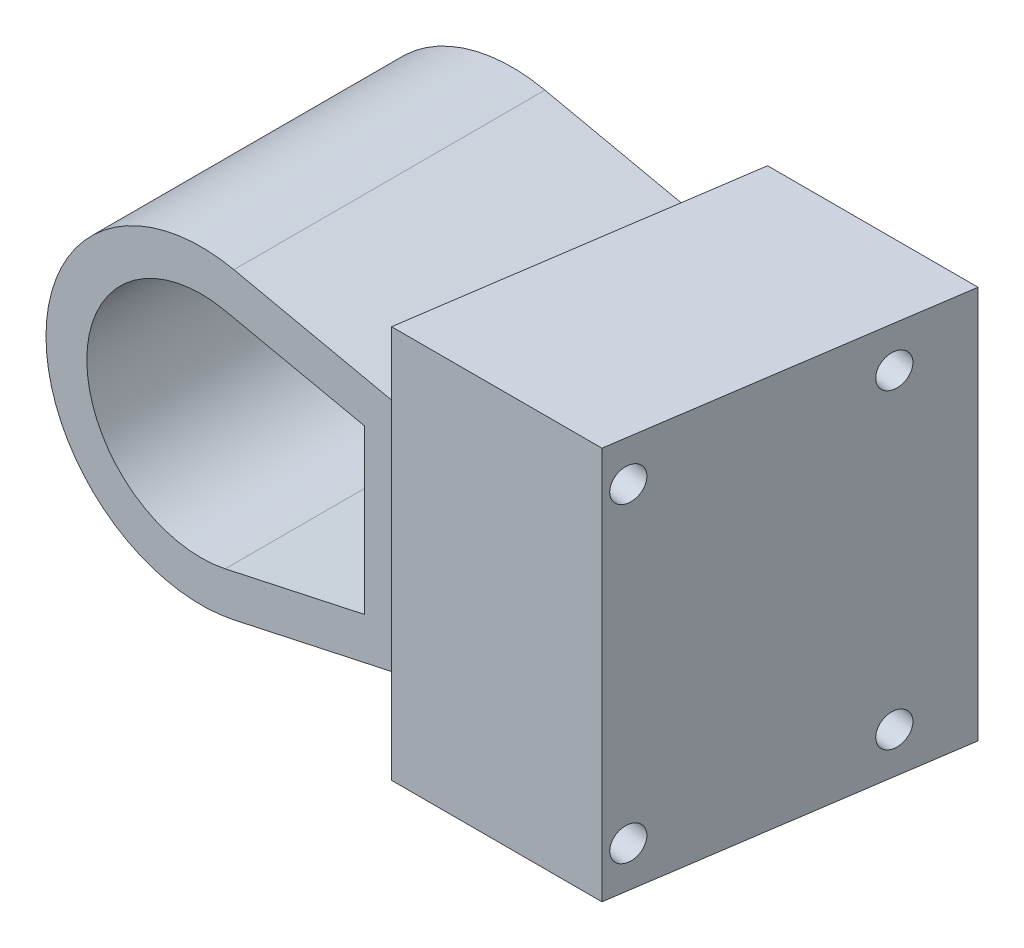
ISO-10303-21;
HEADER;
FILE_DESCRIPTION(('STEP AP214'),'2;1');
FILE_NAME('part.step','',(''),(''),'','','');
FILE_SCHEMA(('AUTOMOTIVE_DESIGN { 1 0 10303 214 1 1 1 1 }'));
ENDSEC;
DATA;
#1=APPLICATION_CONTEXT('core data for automotive mechanical design processes');
#2=APPLICATION_PROTOCOL_DEFINITION('international standard','automotive_design',2000,#1);
#3=PRODUCT_CONTEXT('',#1,'mechanical');
#4=PRODUCT('Part','Part','',(#3));
#5=PRODUCT_RELATED_PRODUCT_CATEGORY('part','',(#4));
#6=PRODUCT_DEFINITION_FORMATION('','',#4);
#7=PRODUCT_DEFINITION_CONTEXT('part definition',#1,'design');
#8=PRODUCT_DEFINITION('design','',#6,#7);
#9=PRODUCT_DEFINITION_SHAPE('','',#8);
#10=(LENGTH_UNIT() NAMED_UNIT(*) SI_UNIT(.MILLI.,.METRE.));
#11=(NAMED_UNIT(*) PLANE_ANGLE_UNIT() SI_UNIT($,.RADIAN.));
#12=(NAMED_UNIT(*) SI_UNIT($,.STERADIAN.) SOLID_ANGLE_UNIT());
#13=UNCERTAINTY_MEASURE_WITH_UNIT(LENGTH_MEASURE(1.E-05),#10,'distance_accuracy_value','');
#14=(GEOMETRIC_REPRESENTATION_CONTEXT(3) GLOBAL_UNCERTAINTY_ASSIGNED_CONTEXT((#13)) GLOBAL_UNIT_ASSIGNED_CONTEXT((#10,
#11,#12)) REPRESENTATION_CONTEXT('',''));
#15=CARTESIAN_POINT('',(0.,0.,0.));
#16=DIRECTION('',(0.,0.,1.));
#17=DIRECTION('',(1.,0.,0.));
#18=AXIS2_PLACEMENT_3D('',#15,#16,#17);
#19=CARTESIAN_POINT('',(-2.30666692097598,-0.12565234013122,38.));
#20=DIRECTION('',(0.,0.,1.));
#21=DIRECTION('',(1.,0.,0.));
#22=AXIS2_PLACEMENT_3D('',#19,#20,#21);
#23=PLANE('',#22);
#24=DIRECTION('',(0.,-1.,0.));
#25=VECTOR('',#24,1.);
#26=CARTESIAN_POINT('',(23.2542228981835,-0.12565234013122,38.));
#27=LINE('',#26,#25);
#28=CARTESIAN_POINT('',(23.2542228981835,14.,38.));
#29=VERTEX_POINT('',#28);
#30=CARTESIAN_POINT('',(23.2542228981835,-14.,38.));
#31=VERTEX_POINT('',#30);
#32=EDGE_CURVE('E63',#29,#31,#27,.T.);
#33=ORIENTED_EDGE('',*,*,#32,.F.);
#34=DIRECTION('',(1.,0.,0.));
#35=VECTOR('',#34,1.);
#36=CARTESIAN_POINT('',(42.6317433366577,14.,38.));
#37=LINE('',#36,#35);
#38=CARTESIAN_POINT('',(22.6317433366577,14.,38.));
#39=VERTEX_POINT('',#38);
#40=EDGE_CURVE('E209',#39,#29,#37,.T.);
#41=ORIENTED_EDGE('',*,*,#40,.F.);
#42=DIRECTION('',(0.,-1.,0.));
#43=VECTOR('',#42,1.);
#44=CARTESIAN_POINT('',(22.6317433366577,14.,38.));
#45=LINE('',#44,#43);
#46=CARTESIAN_POINT('',(22.6317433366577,13.8743476598688,38.));
#47=VERTEX_POINT('',#46);
#48=EDGE_CURVE('E215',#39,#47,#45,.T.);
#49=ORIENTED_EDGE('',*,*,#48,.T.);
#50=DIRECTION('',(-0.977420196479596,0.211304897041662,0.));
#51=VECTOR('',#50,1.);
#52=CARTESIAN_POINT('',(22.6317433366577,13.8743476598688,38.));
#53=LINE('',#52,#51);
#54=CARTESIAN_POINT('',(1.6982985354534,18.3998725204942,38.));
#55=VERTEX_POINT('',#54);
#56=EDGE_CURVE('E265',#47,#55,#53,.T.);
#57=ORIENTED_EDGE('',*,*,#56,.T.);
#58=CARTESIAN_POINT('',(-2.30666692097598,-0.12565234013122,38.));
#59=DIRECTION('',(0.,0.,1.));
#60=DIRECTION('',(1.,0.,0.));
#61=AXIS2_PLACEMENT_3D('',#58,#59,#60);
#62=CIRCLE('',#61,18.9534909625863);
#63=CARTESIAN_POINT('',(1.69829853545341,-18.6511772007566,38.));
#64=VERTEX_POINT('',#63);
#65=EDGE_CURVE('E267',#55,#64,#62,.T.);
#66=ORIENTED_EDGE('',*,*,#65,.T.);
#67=DIRECTION('',(0.977420196479596,0.211304897041662,0.));
#68=VECTOR('',#67,1.);
#69=CARTESIAN_POINT('',(1.69829853545342,-18.6511772007566,38.));
#70=LINE('',#69,#68);
#71=CARTESIAN_POINT('',(22.6317433366577,-14.1256523401312,38.));
#72=VERTEX_POINT('',#71);
#73=EDGE_CURVE('E258',#64,#72,#70,.T.);
#74=ORIENTED_EDGE('',*,*,#73,.T.);
#75=DIRECTION('',(0.,1.,0.));
#76=VECTOR('',#75,1.);
#77=CARTESIAN_POINT('',(22.6317433366577,-14.1256523401312,38.));
#78=LINE('',#77,#76);
#79=CARTESIAN_POINT('',(22.6317433366577,-14.,38.));
#80=VERTEX_POINT('',#79);
#81=EDGE_CURVE('E261',#72,#80,#78,.T.);
#82=ORIENTED_EDGE('',*,*,#81,.T.);
#83=DIRECTION('',(1.,0.,0.));
#84=VECTOR('',#83,1.);
#85=CARTESIAN_POINT('',(42.6317433366577,-14.,38.));
#86=LINE('',#85,#84);
#87=EDGE_CURVE('E208',#80,#31,#86,.T.);
#88=ORIENTED_EDGE('',*,*,#87,.T.);
#89=EDGE_LOOP('',(#33,#41,#49,#57,#66,#74,#82,#88));
#90=FACE_BOUND('',#89,.T.);
#91=DIRECTION('',(0.,1.,0.));
#92=VECTOR('',#91,1.);
#93=CARTESIAN_POINT('',(17.6440612851309,-10.1010164431847,38.));
#94=LINE('',#93,#92);
#95=CARTESIAN_POINT('',(17.6440612851309,-10.1010164431847,38.));
#96=VERTEX_POINT('',#95);
#97=CARTESIAN_POINT('',(17.6440612851309,9.84971176292224,38.));
#98=VERTEX_POINT('',#97);
#99=EDGE_CURVE('E228',#96,#98,#94,.T.);
#100=ORIENTED_EDGE('',*,*,#99,.F.);
#101=DIRECTION('',(0.977420196479597,0.211304897041662,0.));
#102=VECTOR('',#101,1.);
#103=CARTESIAN_POINT('',(0.644376893079009,-13.7761160299756,38.));
#104=LINE('',#103,#102);
#105=CARTESIAN_POINT('',(0.644376893079007,-13.7761160299756,38.));
#106=VERTEX_POINT('',#105);
#107=EDGE_CURVE('E226',#106,#96,#104,.T.);
#108=ORIENTED_EDGE('',*,*,#107,.F.);
#109=CARTESIAN_POINT('',(-2.30666692097598,-0.12565234013122,38.));
#110=DIRECTION('',(0.,0.,1.));
#111=DIRECTION('',(1.,0.,0.));
#112=AXIS2_PLACEMENT_3D('',#109,#110,#111);
#113=CIRCLE('',#112,13.9658089110596);
#114=CARTESIAN_POINT('',(0.644376893079009,13.5248113497132,38.));
#115=VERTEX_POINT('',#114);
#116=EDGE_CURVE('E234',#115,#106,#113,.T.);
#117=ORIENTED_EDGE('',*,*,#116,.F.);
#118=DIRECTION('',(-0.977420196479597,0.211304897041662,0.));
#119=VECTOR('',#118,1.);
#120=CARTESIAN_POINT('',(17.6440612851309,9.84971176292224,38.));
#121=LINE('',#120,#119);
#122=EDGE_CURVE('E231',#98,#115,#121,.T.);
#123=ORIENTED_EDGE('',*,*,#122,.F.);
#124=EDGE_LOOP('',(#100,#108,#117,#123));
#125=FACE_BOUND('',#124,.T.);
#126=ADVANCED_FACE('F38',(#90,#125),#23,.T.);
#127=CARTESIAN_POINT('',(-2.30666692097598,-0.12565234013122,0.));
#128=DIRECTION('',(0.,0.,1.));
#129=DIRECTION('',(1.,0.,0.));
#130=AXIS2_PLACEMENT_3D('',#127,#128,#129);
#131=PLANE('',#130);
#132=DIRECTION('',(-1.,0.,0.));
#133=VECTOR('',#132,1.);
#134=CARTESIAN_POINT('',(22.6317433366577,14.,0.));
#135=LINE('',#134,#133);
#136=CARTESIAN_POINT('',(28.8994634293882,14.,0.));
#137=VERTEX_POINT('',#136);
#138=CARTESIAN_POINT('',(22.6317433366577,14.,0.));
#139=VERTEX_POINT('',#138);
#140=EDGE_CURVE('E162',#137,#139,#135,.T.);
#141=ORIENTED_EDGE('',*,*,#140,.F.);
#142=DIRECTION('',(0.,1.,0.));
#143=VECTOR('',#142,1.);
#144=CARTESIAN_POINT('',(28.8994634293882,-24.,0.));
#145=LINE('',#144,#143);
#146=CARTESIAN_POINT('',(28.8994634293882,24.,0.));
#147=VERTEX_POINT('',#146);
#148=EDGE_CURVE('E155',#137,#147,#145,.T.);
#149=ORIENTED_EDGE('',*,*,#148,.T.);
#150=DIRECTION('',(-1.,0.,0.));
#151=VECTOR('',#150,1.);
#152=CARTESIAN_POINT('',(28.8994634293882,24.,0.));
#153=LINE('',#152,#151);
#154=CARTESIAN_POINT('',(54.608549056261,24.,0.));
#155=VERTEX_POINT('',#154);
#156=EDGE_CURVE('E160',#155,#147,#153,.T.);
#157=ORIENTED_EDGE('',*,*,#156,.F.);
#158=DIRECTION('',(0.,1.,0.));
#159=VECTOR('',#158,1.);
#160=CARTESIAN_POINT('',(54.608549056261,-24.,0.));
#161=LINE('',#160,#159);
#162=CARTESIAN_POINT('',(54.608549056261,-24.,0.));
#163=VERTEX_POINT('',#162);
#164=EDGE_CURVE('E200',#163,#155,#161,.T.);
#165=ORIENTED_EDGE('',*,*,#164,.F.);
#166=DIRECTION('',(-1.,0.,0.));
#167=VECTOR('',#166,1.);
#168=CARTESIAN_POINT('',(28.8994634293882,-24.,0.));
#169=LINE('',#168,#167);
#170=CARTESIAN_POINT('',(28.8994634293882,-24.,0.));
#171=VERTEX_POINT('',#170);
#172=EDGE_CURVE('E190',#163,#171,#169,.T.);
#173=ORIENTED_EDGE('',*,*,#172,.T.);
#174=CARTESIAN_POINT('',(28.8994634293882,-14.,0.));
#175=VERTEX_POINT('',#174);
#176=EDGE_CURVE('E164',#171,#175,#145,.T.);
#177=ORIENTED_EDGE('',*,*,#176,.T.);
#178=DIRECTION('',(-1.,0.,0.));
#179=VECTOR('',#178,1.);
#180=CARTESIAN_POINT('',(22.6317433366577,-14.,0.));
#181=LINE('',#180,#179);
#182=CARTESIAN_POINT('',(22.6317433366577,-14.,0.));
#183=VERTEX_POINT('',#182);
#184=EDGE_CURVE('E217',#175,#183,#181,.T.);
#185=ORIENTED_EDGE('',*,*,#184,.T.);
#186=DIRECTION('',(0.,1.,0.));
#187=VECTOR('',#186,1.);
#188=CARTESIAN_POINT('',(22.6317433366577,-14.1256523401312,0.));
#189=LINE('',#188,#187);
#190=CARTESIAN_POINT('',(22.6317433366577,-14.1256523401312,0.));
#191=VERTEX_POINT('',#190);
#192=EDGE_CURVE('E272',#191,#183,#189,.T.);
#193=ORIENTED_EDGE('',*,*,#192,.F.);
#194=DIRECTION('',(0.977420196479596,0.211304897041662,0.));
#195=VECTOR('',#194,1.);
#196=CARTESIAN_POINT('',(1.69829853545342,-18.6511772007566,0.));
#197=LINE('',#196,#195);
#198=CARTESIAN_POINT('',(1.69829853545341,-18.6511772007566,0.));
#199=VERTEX_POINT('',#198);
#200=EDGE_CURVE('E257',#199,#191,#197,.T.);
#201=ORIENTED_EDGE('',*,*,#200,.F.);
#202=CARTESIAN_POINT('',(-2.30666692097598,-0.12565234013122,0.));
#203=DIRECTION('',(0.,0.,1.));
#204=DIRECTION('',(1.,0.,0.));
#205=AXIS2_PLACEMENT_3D('',#202,#203,#204);
#206=CIRCLE('',#205,18.9534909625864);
#207=CARTESIAN_POINT('',(1.6982985354534,18.3998725204942,0.));
#208=VERTEX_POINT('',#207);
#209=EDGE_CURVE('E262',#208,#199,#206,.T.);
#210=ORIENTED_EDGE('',*,*,#209,.F.);
#211=DIRECTION('',(-0.977420196479596,0.211304897041662,0.));
#212=VECTOR('',#211,1.);
#213=CARTESIAN_POINT('',(22.6317433366577,13.8743476598688,0.));
#214=LINE('',#213,#212);
#215=CARTESIAN_POINT('',(22.6317433366577,13.8743476598688,0.));
#216=VERTEX_POINT('',#215);
#217=EDGE_CURVE('E275',#216,#208,#214,.T.);
#218=ORIENTED_EDGE('',*,*,#217,.F.);
#219=DIRECTION('',(0.,-1.,0.));
#220=VECTOR('',#219,1.);
#221=CARTESIAN_POINT('',(22.6317433366577,14.,0.));
#222=LINE('',#221,#220);
#223=EDGE_CURVE('E223',#139,#216,#222,.T.);
#224=ORIENTED_EDGE('',*,*,#223,.F.);
#225=EDGE_LOOP('',(#141,#149,#157,#165,#173,#177,#185,#193,#201,#210,#218,#224));
#226=FACE_BOUND('',#225,.T.);
#227=DIRECTION('',(0.977420196479597,0.211304897041662,0.));
#228=VECTOR('',#227,1.);
#229=CARTESIAN_POINT('',(0.644376893079009,-13.7761160299756,0.));
#230=LINE('',#229,#228);
#231=CARTESIAN_POINT('',(0.644376893079007,-13.7761160299756,0.));
#232=VERTEX_POINT('',#231);
#233=CARTESIAN_POINT('',(17.6440612851309,-10.1010164431847,0.));
#234=VERTEX_POINT('',#233);
#235=EDGE_CURVE('E225',#232,#234,#230,.T.);
#236=ORIENTED_EDGE('',*,*,#235,.T.);
#237=DIRECTION('',(0.,1.,0.));
#238=VECTOR('',#237,1.);
#239=CARTESIAN_POINT('',(17.6440612851309,-10.1010164431847,0.));
#240=LINE('',#239,#238);
#241=CARTESIAN_POINT('',(17.6440612851309,9.84971176292224,0.));
#242=VERTEX_POINT('',#241);
#243=EDGE_CURVE('E239',#234,#242,#240,.T.);
#244=ORIENTED_EDGE('',*,*,#243,.T.);
#245=DIRECTION('',(-0.977420196479597,0.211304897041662,0.));
#246=VECTOR('',#245,1.);
#247=CARTESIAN_POINT('',(17.6440612851309,9.84971176292224,0.));
#248=LINE('',#247,#246);
#249=CARTESIAN_POINT('',(0.644376893079009,13.5248113497132,0.));
#250=VERTEX_POINT('',#249);
#251=EDGE_CURVE('E242',#242,#250,#248,.T.);
#252=ORIENTED_EDGE('',*,*,#251,.T.);
#253=CARTESIAN_POINT('',(-2.30666692097598,-0.12565234013122,0.));
#254=DIRECTION('',(0.,0.,1.));
#255=DIRECTION('',(1.,0.,0.));
#256=AXIS2_PLACEMENT_3D('',#253,#254,#255);
#257=CIRCLE('',#256,13.9658089110596);
#258=EDGE_CURVE('E229',#250,#232,#257,.T.);
#259=ORIENTED_EDGE('',*,*,#258,.T.);
#260=EDGE_LOOP('',(#236,#244,#252,#259));
#261=FACE_BOUND('',#260,.T.);
#262=ADVANCED_FACE('F157',(#226,#261),#131,.F.);
#263=CARTESIAN_POINT('',(1.69829853545342,-18.6511772007566,38.));
#264=DIRECTION('',(-0.211304897041662,0.977420196479596,0.));
#265=DIRECTION('',(-0.977420196479596,-0.211304897041662,0.));
#266=AXIS2_PLACEMENT_3D('',#263,#264,#265);
#267=PLANE('',#266);
#268=ORIENTED_EDGE('',*,*,#200,.T.);
#269=DIRECTION('',(0.,0.,-1.));
#270=VECTOR('',#269,1.);
#271=CARTESIAN_POINT('',(22.6317433366577,-14.1256523401312,38.));
#272=LINE('',#271,#270);
#273=EDGE_CURVE('E47',#72,#191,#272,.T.);
#274=ORIENTED_EDGE('',*,*,#273,.F.);
#275=ORIENTED_EDGE('',*,*,#73,.F.);
#276=DIRECTION('',(0.,0.,-1.));
#277=VECTOR('',#276,1.);
#278=CARTESIAN_POINT('',(1.69829853545341,-18.6511772007566,38.));
#279=LINE('',#278,#277);
#280=EDGE_CURVE('E269',#64,#199,#279,.T.);
#281=ORIENTED_EDGE('',*,*,#280,.T.);
#282=EDGE_LOOP('',(#268,#274,#275,#281));
#283=FACE_BOUND('',#282,.T.);
#284=ADVANCED_FACE('F40',(#283),#267,.F.);
#285=CARTESIAN_POINT('',(22.6317433366577,-14.1256523401312,38.));
#286=DIRECTION('',(-1.,0.,0.));
#287=DIRECTION('',(0.,0.,1.));
#288=AXIS2_PLACEMENT_3D('',#285,#286,#287);
#289=PLANE('',#288);
#290=ORIENTED_EDGE('',*,*,#192,.T.);
#291=DIRECTION('',(0.,0.,1.));
#292=VECTOR('',#291,1.);
#293=CARTESIAN_POINT('',(22.6317433366577,-14.,38.));
#294=LINE('',#293,#292);
#295=EDGE_CURVE('E211',#183,#80,#294,.T.);
#296=ORIENTED_EDGE('',*,*,#295,.T.);
#297=ORIENTED_EDGE('',*,*,#81,.F.);
#298=ORIENTED_EDGE('',*,*,#273,.T.);
#299=EDGE_LOOP('',(#290,#296,#297,#298));
#300=FACE_BOUND('',#299,.T.);
#301=ADVANCED_FACE('F321',(#300),#289,.F.);
#302=CARTESIAN_POINT('',(22.6317433366577,13.8743476598688,38.));
#303=DIRECTION('',(-0.211304897041662,-0.977420196479596,0.));
#304=DIRECTION('',(0.977420196479596,-0.211304897041662,0.));
#305=AXIS2_PLACEMENT_3D('',#302,#303,#304);
#306=PLANE('',#305);
#307=ORIENTED_EDGE('',*,*,#217,.T.);
#308=DIRECTION('',(0.,0.,-1.));
#309=VECTOR('',#308,1.);
#310=CARTESIAN_POINT('',(1.6982985354534,18.3998725204942,38.));
#311=LINE('',#310,#309);
#312=EDGE_CURVE('E281',#55,#208,#311,.T.);
#313=ORIENTED_EDGE('',*,*,#312,.F.);
#314=ORIENTED_EDGE('',*,*,#56,.F.);
#315=DIRECTION('',(0.,0.,-1.));
#316=VECTOR('',#315,1.);
#317=CARTESIAN_POINT('',(22.6317433366577,13.8743476598688,38.));
#318=LINE('',#317,#316);
#319=EDGE_CURVE('E284',#47,#216,#318,.T.);
#320=ORIENTED_EDGE('',*,*,#319,.T.);
#321=EDGE_LOOP('',(#307,#313,#314,#320));
#322=FACE_BOUND('',#321,.T.);
#323=ADVANCED_FACE('F330',(#322),#306,.F.);
#324=CARTESIAN_POINT('',(-2.30666692097598,-0.12565234013122,38.));
#325=DIRECTION('',(0.,0.,-1.));
#326=DIRECTION('',(-1.,0.,0.));
#327=AXIS2_PLACEMENT_3D('',#324,#325,#326);
#328=CYLINDRICAL_SURFACE('',#327,18.9534909625864);
#329=ORIENTED_EDGE('',*,*,#209,.T.);
#330=ORIENTED_EDGE('',*,*,#280,.F.);
#331=ORIENTED_EDGE('',*,*,#65,.F.);
#332=ORIENTED_EDGE('',*,*,#312,.T.);
#333=EDGE_LOOP('',(#329,#330,#331,#332));
#334=FACE_BOUND('',#333,.T.);
#335=ADVANCED_FACE('F333',(#334),#328,.T.);
#336=CARTESIAN_POINT('',(0.644376893079009,-13.7761160299756,38.));
#337=DIRECTION('',(-0.211304897041662,0.977420196479596,0.));
#338=DIRECTION('',(-0.977420196479597,-0.211304897041662,0.));
#339=AXIS2_PLACEMENT_3D('',#336,#337,#338);
#340=PLANE('',#339);
#341=ORIENTED_EDGE('',*,*,#235,.F.);
#342=DIRECTION('',(0.,0.,-1.));
#343=VECTOR('',#342,1.);
#344=CARTESIAN_POINT('',(0.644376893079007,-13.7761160299756,38.));
#345=LINE('',#344,#343);
#346=EDGE_CURVE('E236',#106,#232,#345,.T.);
#347=ORIENTED_EDGE('',*,*,#346,.F.);
#348=ORIENTED_EDGE('',*,*,#107,.T.);
#349=DIRECTION('',(0.,0.,-1.));
#350=VECTOR('',#349,1.);
#351=CARTESIAN_POINT('',(17.6440612851309,-10.1010164431847,38.));
#352=LINE('',#351,#350);
#353=EDGE_CURVE('E254',#96,#234,#352,.T.);
#354=ORIENTED_EDGE('',*,*,#353,.T.);
#355=EDGE_LOOP('',(#341,#347,#348,#354));
#356=FACE_BOUND('',#355,.T.);
#357=ADVANCED_FACE('F357',(#356),#340,.T.);
#358=CARTESIAN_POINT('',(17.6440612851309,-10.1010164431847,38.));
#359=DIRECTION('',(-1.,0.,0.));
#360=DIRECTION('',(0.,0.,1.));
#361=AXIS2_PLACEMENT_3D('',#358,#359,#360);
#362=PLANE('',#361);
#363=ORIENTED_EDGE('',*,*,#243,.F.);
#364=ORIENTED_EDGE('',*,*,#353,.F.);
#365=ORIENTED_EDGE('',*,*,#99,.T.);
#366=DIRECTION('',(0.,0.,-1.));
#367=VECTOR('',#366,1.);
#368=CARTESIAN_POINT('',(17.6440612851309,9.84971176292224,38.));
#369=LINE('',#368,#367);
#370=EDGE_CURVE('E252',#98,#242,#369,.T.);
#371=ORIENTED_EDGE('',*,*,#370,.T.);
#372=EDGE_LOOP('',(#363,#364,#365,#371));
#373=FACE_BOUND('',#372,.T.);
#374=ADVANCED_FACE('F540',(#373),#362,.T.);
#375=CARTESIAN_POINT('',(17.6440612851309,9.84971176292224,38.));
#376=DIRECTION('',(-0.211304897041662,-0.977420196479596,0.));
#377=DIRECTION('',(0.977420196479597,-0.211304897041662,0.));
#378=AXIS2_PLACEMENT_3D('',#375,#376,#377);
#379=PLANE('',#378);
#380=ORIENTED_EDGE('',*,*,#251,.F.);
#381=ORIENTED_EDGE('',*,*,#370,.F.);
#382=ORIENTED_EDGE('',*,*,#122,.T.);
#383=DIRECTION('',(0.,0.,-1.));
#384=VECTOR('',#383,1.);
#385=CARTESIAN_POINT('',(0.644376893079009,13.5248113497132,38.));
#386=LINE('',#385,#384);
#387=EDGE_CURVE('E249',#115,#250,#386,.T.);
#388=ORIENTED_EDGE('',*,*,#387,.T.);
#389=EDGE_LOOP('',(#380,#381,#382,#388));
#390=FACE_BOUND('',#389,.T.);
#391=ADVANCED_FACE('F510',(#390),#379,.T.);
#392=CARTESIAN_POINT('',(-2.30666692097598,-0.12565234013122,38.));
#393=DIRECTION('',(0.,0.,-1.));
#394=DIRECTION('',(-1.,0.,0.));
#395=AXIS2_PLACEMENT_3D('',#392,#393,#394);
#396=CYLINDRICAL_SURFACE('',#395,13.9658089110596);
#397=ORIENTED_EDGE('',*,*,#258,.F.);
#398=ORIENTED_EDGE('',*,*,#387,.F.);
#399=ORIENTED_EDGE('',*,*,#116,.T.);
#400=ORIENTED_EDGE('',*,*,#346,.T.);
#401=EDGE_LOOP('',(#397,#398,#399,#400));
#402=FACE_BOUND('',#401,.T.);
#403=ADVANCED_FACE('F347',(#402),#396,.F.);
#404=CARTESIAN_POINT('',(22.6317433366577,14.,38.));
#405=DIRECTION('',(1.,0.,0.));
#406=DIRECTION('',(0.,0.,-1.));
#407=AXIS2_PLACEMENT_3D('',#404,#405,#406);
#408=PLANE('',#407);
#409=ORIENTED_EDGE('',*,*,#319,.F.);
#410=ORIENTED_EDGE('',*,*,#48,.F.);
#411=DIRECTION('',(0.,0.,1.));
#412=VECTOR('',#411,1.);
#413=CARTESIAN_POINT('',(22.6317433366577,14.,38.));
#414=LINE('',#413,#412);
#415=EDGE_CURVE('E213',#139,#39,#414,.T.);
#416=ORIENTED_EDGE('',*,*,#415,.F.);
#417=ORIENTED_EDGE('',*,*,#223,.T.);
#418=EDGE_LOOP('',(#409,#410,#416,#417));
#419=FACE_BOUND('',#418,.T.);
#420=ADVANCED_FACE('F338',(#419),#408,.F.);
#421=CARTESIAN_POINT('',(0.,14.,0.));
#422=DIRECTION('',(0.,-1.,0.));
#423=DIRECTION('',(0.,0.,-1.));
#424=AXIS2_PLACEMENT_3D('',#421,#422,#423);
#425=PLANE('',#424);
#426=ORIENTED_EDGE('',*,*,#40,.T.);
#427=DIRECTION('',(0.146946275799005,0.,-0.989144474800725));
#428=VECTOR('',#427,1.);
#429=CARTESIAN_POINT('',(28.2754313053014,14.,4.20056870636791));
#430=LINE('',#429,#428);
#431=EDGE_CURVE('E55',#29,#137,#430,.T.);
#432=ORIENTED_EDGE('',*,*,#431,.T.);
#433=ORIENTED_EDGE('',*,*,#140,.T.);
#434=ORIENTED_EDGE('',*,*,#415,.T.);
#435=EDGE_LOOP('',(#426,#432,#433,#434));
#436=FACE_BOUND('',#435,.T.);
#437=ADVANCED_FACE('F339',(#436),#425,.F.);
#438=CARTESIAN_POINT('',(0.,-14.,0.));
#439=DIRECTION('',(0.,-1.,0.));
#440=DIRECTION('',(0.,0.,-1.));
#441=AXIS2_PLACEMENT_3D('',#438,#439,#440);
#442=PLANE('',#441);
#443=DIRECTION('',(0.146946275799005,0.,-0.989144474800725));
#444=VECTOR('',#443,1.);
#445=CARTESIAN_POINT('',(28.2754313053014,-14.,4.20056870636791));
#446=LINE('',#445,#444);
#447=EDGE_CURVE('E11',#31,#175,#446,.T.);
#448=ORIENTED_EDGE('',*,*,#447,.F.);
#449=ORIENTED_EDGE('',*,*,#87,.F.);
#450=ORIENTED_EDGE('',*,*,#295,.F.);
#451=ORIENTED_EDGE('',*,*,#184,.F.);
#452=EDGE_LOOP('',(#448,#449,#450,#451));
#453=FACE_BOUND('',#452,.T.);
#454=ADVANCED_FACE('F319',(#453),#442,.T.);
#455=CARTESIAN_POINT('',(28.8994634293882,-24.,0.));
#456=DIRECTION('',(-0.989144474800725,0.,-0.146946275799005));
#457=DIRECTION('',(-0.146946275799005,0.,0.989144474800725));
#458=AXIS2_PLACEMENT_3D('',#455,#456,#457);
#459=PLANE('',#458);
#460=CARTESIAN_POINT('',(23.9282987333605,19.,33.4625703554811));
#461=DIRECTION('',(-0.989144474800725,0.,-0.146946275799005));
#462=DIRECTION('',(-0.146946275799005,0.,0.989144474800725));
#463=AXIS2_PLACEMENT_3D('',#460,#461,#462);
#464=CIRCLE('',#463,2.);
#465=CARTESIAN_POINT('',(23.6344061817625,19.,35.4408593050826));
#466=VERTEX_POINT('',#465);
#467=EDGE_CURVE('E474',#466,#466,#464,.T.);
#468=ORIENTED_EDGE('',*,*,#467,.F.);
#469=EDGE_LOOP('',(#468));
#470=FACE_BOUND('',#469,.T.);
#471=CARTESIAN_POINT('',(28.1322226060947,-19.,5.1645543044612));
#472=DIRECTION('',(-0.989144474800725,0.,-0.146946275799005));
#473=DIRECTION('',(-0.146946275799005,0.,0.989144474800725));
#474=AXIS2_PLACEMENT_3D('',#471,#472,#473);
#475=CIRCLE('',#474,2.);
#476=CARTESIAN_POINT('',(27.8383300544967,-19.,7.14284325406265));
#477=VERTEX_POINT('',#476);
#478=EDGE_CURVE('E475',#477,#477,#475,.T.);
#479=ORIENTED_EDGE('',*,*,#478,.F.);
#480=EDGE_LOOP('',(#479));
#481=FACE_BOUND('',#480,.T.);
#482=CARTESIAN_POINT('',(23.9282987333605,-19.,33.4625703554811));
#483=DIRECTION('',(-0.989144474800725,0.,-0.146946275799005));
#484=DIRECTION('',(-0.146946275799005,0.,0.989144474800725));
#485=AXIS2_PLACEMENT_3D('',#482,#483,#484);
#486=CIRCLE('',#485,2.);
#487=CARTESIAN_POINT('',(23.6344061817625,-19.,35.4408593050826));
#488=VERTEX_POINT('',#487);
#489=EDGE_CURVE('E479',#488,#488,#486,.T.);
#490=ORIENTED_EDGE('',*,*,#489,.F.);
#491=EDGE_LOOP('',(#490));
#492=FACE_BOUND('',#491,.T.);
#493=CARTESIAN_POINT('',(28.1322226060947,19.,5.1645543044612));
#494=DIRECTION('',(-0.989144474800725,0.,-0.146946275799005));
#495=DIRECTION('',(-0.146946275799005,0.,0.989144474800725));
#496=AXIS2_PLACEMENT_3D('',#493,#494,#495);
#497=CIRCLE('',#496,2.);
#498=CARTESIAN_POINT('',(27.8383300544967,19.,7.14284325406265));
#499=VERTEX_POINT('',#498);
#500=EDGE_CURVE('E185',#499,#499,#497,.T.);
#501=ORIENTED_EDGE('',*,*,#500,.F.);
#502=EDGE_LOOP('',(#501));
#503=FACE_BOUND('',#502,.T.);
#504=ORIENTED_EDGE('',*,*,#431,.F.);
#505=ORIENTED_EDGE('',*,*,#32,.T.);
#506=ORIENTED_EDGE('',*,*,#447,.T.);
#507=ORIENTED_EDGE('',*,*,#176,.F.);
#508=DIRECTION('',(-0.146946275799005,0.,0.989144474800725));
#509=VECTOR('',#508,1.);
#510=CARTESIAN_POINT('',(28.8994634293882,-24.,0.));
#511=LINE('',#510,#509);
#512=CARTESIAN_POINT('',(22.9571049754885,-24.,40.));
#513=VERTEX_POINT('',#512);
#514=EDGE_CURVE('E193',#171,#513,#511,.T.);
#515=ORIENTED_EDGE('',*,*,#514,.T.);
#516=DIRECTION('',(0.,1.,0.));
#517=VECTOR('',#516,1.);
#518=CARTESIAN_POINT('',(22.9571049754885,-24.,40.));
#519=LINE('',#518,#517);
#520=CARTESIAN_POINT('',(22.9571049754885,24.,40.));
#521=VERTEX_POINT('',#520);
#522=EDGE_CURVE('E171',#513,#521,#519,.T.);
#523=ORIENTED_EDGE('',*,*,#522,.T.);
#524=DIRECTION('',(-0.146946275799005,0.,0.989144474800725));
#525=VECTOR('',#524,1.);
#526=CARTESIAN_POINT('',(28.8994634293882,24.,0.));
#527=LINE('',#526,#525);
#528=EDGE_CURVE('E168',#147,#521,#527,.T.);
#529=ORIENTED_EDGE('',*,*,#528,.F.);
#530=ORIENTED_EDGE('',*,*,#148,.F.);
#531=EDGE_LOOP('',(#504,#505,#506,#507,#515,#523,#529,#530));
#532=FACE_BOUND('',#531,.T.);
#533=ADVANCED_FACE('F169',(#470,#481,#492,#503,#532),#459,.T.);
#534=CARTESIAN_POINT('',(54.608549056261,-24.,0.));
#535=DIRECTION('',(0.989144474800725,0.,0.146946275799005));
#536=DIRECTION('',(0.146946275799005,0.,-0.989144474800725));
#537=AXIS2_PLACEMENT_3D('',#534,#535,#536);
#538=PLANE('',#537);
#539=CARTESIAN_POINT('',(49.082242727543,19.,37.1994141490499));
#540=DIRECTION('',(0.989144474800725,0.,0.146946275799005));
#541=DIRECTION('',(0.146946275799005,0.,-0.989144474800725));
#542=AXIS2_PLACEMENT_3D('',#539,#540,#541);
#543=CIRCLE('',#542,2.);
#544=CARTESIAN_POINT('',(49.376135279141,19.,35.2211251994484));
#545=VERTEX_POINT('',#544);
#546=EDGE_CURVE('E42',#545,#545,#543,.T.);
#547=ORIENTED_EDGE('',*,*,#546,.F.);
#548=EDGE_LOOP('',(#547));
#549=FACE_BOUND('',#548,.T.);
#550=CARTESIAN_POINT('',(53.2861666002771,-19.,8.90139809802991));
#551=DIRECTION('',(0.989144474800725,0.,0.146946275799005));
#552=DIRECTION('',(0.146946275799005,0.,-0.989144474800725));
#553=AXIS2_PLACEMENT_3D('',#550,#551,#552);
#554=CIRCLE('',#553,2.);
#555=CARTESIAN_POINT('',(53.5800591518751,-19.,6.92310914842846));
#556=VERTEX_POINT('',#555);
#557=EDGE_CURVE('E183',#556,#556,#554,.T.);
#558=ORIENTED_EDGE('',*,*,#557,.F.);
#559=EDGE_LOOP('',(#558));
#560=FACE_BOUND('',#559,.T.);
#561=CARTESIAN_POINT('',(49.082242727543,-19.,37.1994141490499));
#562=DIRECTION('',(0.989144474800725,0.,0.146946275799005));
#563=DIRECTION('',(0.146946275799005,0.,-0.989144474800725));
#564=AXIS2_PLACEMENT_3D('',#561,#562,#563);
#565=CIRCLE('',#564,2.);
#566=CARTESIAN_POINT('',(49.376135279141,-19.,35.2211251994484));
#567=VERTEX_POINT('',#566);
#568=EDGE_CURVE('E292',#567,#567,#565,.T.);
#569=ORIENTED_EDGE('',*,*,#568,.F.);
#570=EDGE_LOOP('',(#569));
#571=FACE_BOUND('',#570,.T.);
#572=CARTESIAN_POINT('',(53.2861666002771,19.,8.90139809802991));
#573=DIRECTION('',(0.989144474800725,0.,0.146946275799005));
#574=DIRECTION('',(0.146946275799005,0.,-0.989144474800725));
#575=AXIS2_PLACEMENT_3D('',#572,#573,#574);
#576=CIRCLE('',#575,2.);
#577=CARTESIAN_POINT('',(53.5800591518751,19.,6.92310914842846));
#578=VERTEX_POINT('',#577);
#579=EDGE_CURVE('E289',#578,#578,#576,.T.);
#580=ORIENTED_EDGE('',*,*,#579,.F.);
#581=EDGE_LOOP('',(#580));
#582=FACE_BOUND('',#581,.T.);
#583=ORIENTED_EDGE('',*,*,#164,.T.);
#584=DIRECTION('',(0.146946275799005,0.,-0.989144474800725));
#585=VECTOR('',#584,1.);
#586=CARTESIAN_POINT('',(54.608549056261,24.,0.));
#587=LINE('',#586,#585);
#588=CARTESIAN_POINT('',(48.6661906023613,24.,40.));
#589=VERTEX_POINT('',#588);
#590=EDGE_CURVE('E180',#589,#155,#587,.T.);
#591=ORIENTED_EDGE('',*,*,#590,.F.);
#592=DIRECTION('',(0.,1.,0.));
#593=VECTOR('',#592,1.);
#594=CARTESIAN_POINT('',(48.6661906023613,-24.,40.));
#595=LINE('',#594,#593);
#596=CARTESIAN_POINT('',(48.6661906023613,-24.,40.));
#597=VERTEX_POINT('',#596);
#598=EDGE_CURVE('E202',#597,#589,#595,.T.);
#599=ORIENTED_EDGE('',*,*,#598,.F.);
#600=DIRECTION('',(0.146946275799005,0.,-0.989144474800725));
#601=VECTOR('',#600,1.);
#602=CARTESIAN_POINT('',(54.608549056261,-24.,0.));
#603=LINE('',#602,#601);
#604=EDGE_CURVE('E165',#597,#163,#603,.T.);
#605=ORIENTED_EDGE('',*,*,#604,.T.);
#606=EDGE_LOOP('',(#583,#591,#599,#605));
#607=FACE_BOUND('',#606,.T.);
#608=ADVANCED_FACE('F300',(#549,#560,#571,#582,#607),#538,.T.);
#609=CARTESIAN_POINT('',(48.6661906023613,-24.,40.));
#610=DIRECTION('',(0.,0.,1.));
#611=DIRECTION('',(1.,0.,0.));
#612=AXIS2_PLACEMENT_3D('',#609,#610,#611);
#613=PLANE('',#612);
#614=ORIENTED_EDGE('',*,*,#598,.T.);
#615=DIRECTION('',(1.,0.,0.));
#616=VECTOR('',#615,1.);
#617=CARTESIAN_POINT('',(48.6661906023613,24.,40.));
#618=LINE('',#617,#616);
#619=EDGE_CURVE('E175',#521,#589,#618,.T.);
#620=ORIENTED_EDGE('',*,*,#619,.F.);
#621=ORIENTED_EDGE('',*,*,#522,.F.);
#622=DIRECTION('',(1.,0.,0.));
#623=VECTOR('',#622,1.);
#624=CARTESIAN_POINT('',(48.6661906023613,-24.,40.));
#625=LINE('',#624,#623);
#626=EDGE_CURVE('E195',#513,#597,#625,.T.);
#627=ORIENTED_EDGE('',*,*,#626,.T.);
#628=EDGE_LOOP('',(#614,#620,#621,#627));
#629=FACE_BOUND('',#628,.T.);
#630=ADVANCED_FACE('F303',(#629),#613,.T.);
#631=CARTESIAN_POINT('',(0.,-24.,0.));
#632=DIRECTION('',(0.,-1.,0.));
#633=DIRECTION('',(0.,0.,-1.));
#634=AXIS2_PLACEMENT_3D('',#631,#632,#633);
#635=PLANE('',#634);
#636=ORIENTED_EDGE('',*,*,#172,.F.);
#637=ORIENTED_EDGE('',*,*,#604,.F.);
#638=ORIENTED_EDGE('',*,*,#626,.F.);
#639=ORIENTED_EDGE('',*,*,#514,.F.);
#640=EDGE_LOOP('',(#636,#637,#638,#639));
#641=FACE_BOUND('',#640,.T.);
#642=ADVANCED_FACE('F314',(#641),#635,.T.);
#643=CARTESIAN_POINT('',(0.,24.,0.));
#644=DIRECTION('',(0.,-1.,0.));
#645=DIRECTION('',(0.,0.,-1.));
#646=AXIS2_PLACEMENT_3D('',#643,#644,#645);
#647=PLANE('',#646);
#648=ORIENTED_EDGE('',*,*,#156,.T.);
#649=ORIENTED_EDGE('',*,*,#528,.T.);
#650=ORIENTED_EDGE('',*,*,#619,.T.);
#651=ORIENTED_EDGE('',*,*,#590,.T.);
#652=EDGE_LOOP('',(#648,#649,#650,#651));
#653=FACE_BOUND('',#652,.T.);
#654=ADVANCED_FACE('F178',(#653),#647,.F.);
#655=CARTESIAN_POINT('',(63.7414236989208,19.,10.4546202332254));
#656=DIRECTION('',(-0.989144474800725,0.,-0.146946275799005));
#657=DIRECTION('',(-0.146946275799005,0.,0.989144474800725));
#658=AXIS2_PLACEMENT_3D('',#655,#656,#657);
#659=CYLINDRICAL_SURFACE('',#658,2.);
#660=ORIENTED_EDGE('',*,*,#579,.T.);
#661=EDGE_LOOP('',(#660));
#662=FACE_BOUND('',#661,.T.);
#663=ORIENTED_EDGE('',*,*,#500,.T.);
#664=EDGE_LOOP('',(#663));
#665=FACE_BOUND('',#664,.T.);
#666=ADVANCED_FACE('F418',(#662,#665),#659,.F.);
#667=CARTESIAN_POINT('',(59.5374998261867,-19.,38.7526362842453));
#668=DIRECTION('',(-0.989144474800725,0.,-0.146946275799005));
#669=DIRECTION('',(-0.146946275799005,0.,0.989144474800725));
#670=AXIS2_PLACEMENT_3D('',#667,#668,#669);
#671=CYLINDRICAL_SURFACE('',#670,2.);
#672=ORIENTED_EDGE('',*,*,#568,.T.);
#673=EDGE_LOOP('',(#672));
#674=FACE_BOUND('',#673,.T.);
#675=ORIENTED_EDGE('',*,*,#489,.T.);
#676=EDGE_LOOP('',(#675));
#677=FACE_BOUND('',#676,.T.);
#678=ADVANCED_FACE('F438',(#674,#677),#671,.F.);
#679=CARTESIAN_POINT('',(63.7414236989208,-19.,10.4546202332254));
#680=DIRECTION('',(-0.989144474800725,0.,-0.146946275799005));
#681=DIRECTION('',(-0.146946275799005,0.,0.989144474800725));
#682=AXIS2_PLACEMENT_3D('',#679,#680,#681);
#683=CYLINDRICAL_SURFACE('',#682,2.);
#684=ORIENTED_EDGE('',*,*,#557,.T.);
#685=EDGE_LOOP('',(#684));
#686=FACE_BOUND('',#685,.T.);
#687=ORIENTED_EDGE('',*,*,#478,.T.);
#688=EDGE_LOOP('',(#687));
#689=FACE_BOUND('',#688,.T.);
#690=ADVANCED_FACE('F297',(#686,#689),#683,.F.);
#691=CARTESIAN_POINT('',(59.5374998261867,19.,38.7526362842453));
#692=DIRECTION('',(-0.989144474800725,0.,-0.146946275799005));
#693=DIRECTION('',(-0.146946275799005,0.,0.989144474800725));
#694=AXIS2_PLACEMENT_3D('',#691,#692,#693);
#695=CYLINDRICAL_SURFACE('',#694,2.);
#696=ORIENTED_EDGE('',*,*,#546,.T.);
#697=EDGE_LOOP('',(#696));
#698=FACE_BOUND('',#697,.T.);
#699=ORIENTED_EDGE('',*,*,#467,.T.);
#700=EDGE_LOOP('',(#699));
#701=FACE_BOUND('',#700,.T.);
#702=ADVANCED_FACE('F457',(#698,#701),#695,.F.);
#703=CLOSED_SHELL('',(#126,#262,#284,#301,#323,#335,#357,#374,#391,#403,#420,#437,#454,#533,
#608,#630,#642,#654,#666,#678,#690,#702));
#704=MANIFOLD_SOLID_BREP('B2',#703);
#705=ADVANCED_BREP_SHAPE_REPRESENTATION('',(#18,#704),#14);
#706=SHAPE_DEFINITION_REPRESENTATION(#9,#705);
ENDSEC;
END-ISO-10303-21;
